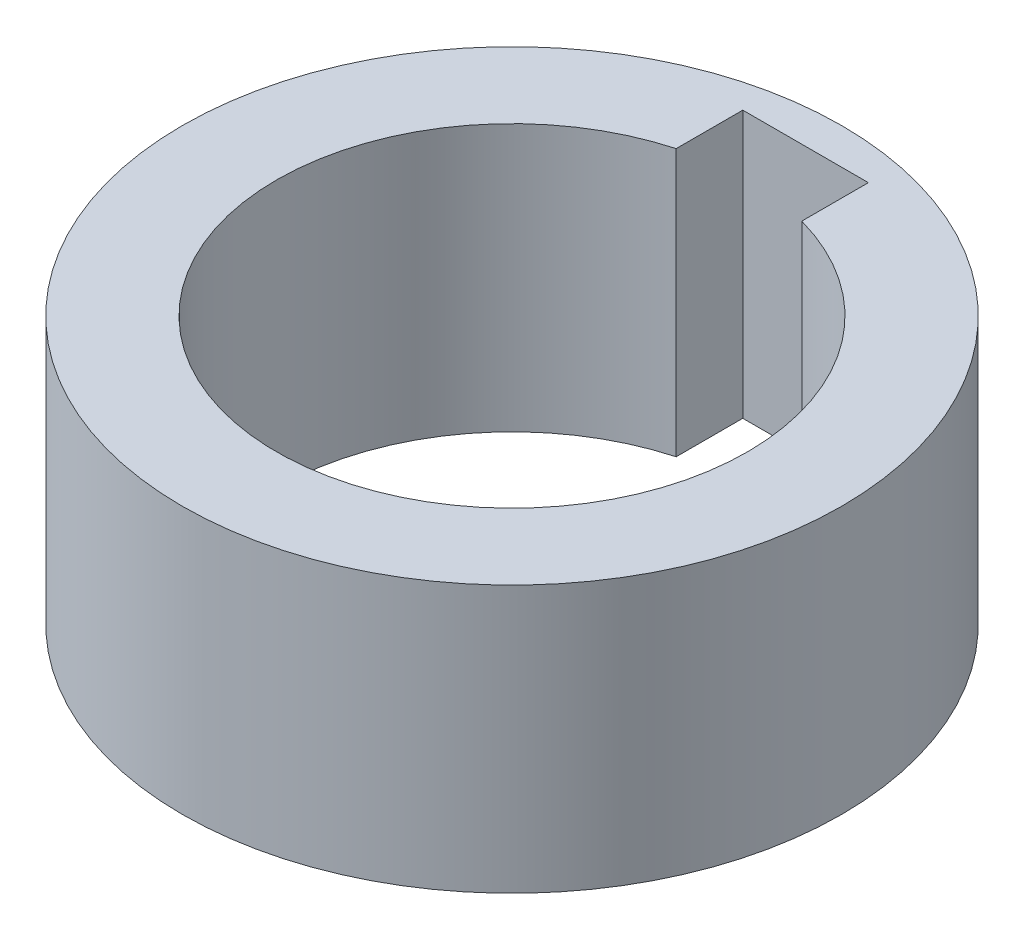
ISO-10303-21;
HEADER;
FILE_DESCRIPTION(('STEP AP214'),'2;1');
FILE_NAME('part.step','',(''),(''),'','','');
FILE_SCHEMA(('AUTOMOTIVE_DESIGN { 1 0 10303 214 1 1 1 1 }'));
ENDSEC;
DATA;
#1=APPLICATION_CONTEXT('core data for automotive mechanical design processes');
#2=APPLICATION_PROTOCOL_DEFINITION('international standard','automotive_design',2000,#1);
#3=PRODUCT_CONTEXT('',#1,'mechanical');
#4=PRODUCT('Part','Part','',(#3));
#5=PRODUCT_RELATED_PRODUCT_CATEGORY('part','',(#4));
#6=PRODUCT_DEFINITION_FORMATION('','',#4);
#7=PRODUCT_DEFINITION_CONTEXT('part definition',#1,'design');
#8=PRODUCT_DEFINITION('design','',#6,#7);
#9=PRODUCT_DEFINITION_SHAPE('','',#8);
#10=(LENGTH_UNIT() NAMED_UNIT(*) SI_UNIT(.MILLI.,.METRE.));
#11=(NAMED_UNIT(*) PLANE_ANGLE_UNIT() SI_UNIT($,.RADIAN.));
#12=(NAMED_UNIT(*) SI_UNIT($,.STERADIAN.) SOLID_ANGLE_UNIT());
#13=UNCERTAINTY_MEASURE_WITH_UNIT(LENGTH_MEASURE(1.E-05),#10,'distance_accuracy_value','');
#14=(GEOMETRIC_REPRESENTATION_CONTEXT(3) GLOBAL_UNCERTAINTY_ASSIGNED_CONTEXT((#13)) GLOBAL_UNIT_ASSIGNED_CONTEXT((#10,
#11,#12)) REPRESENTATION_CONTEXT('',''));
#15=CARTESIAN_POINT('',(0.,0.,0.));
#16=DIRECTION('',(0.,0.,1.));
#17=DIRECTION('',(1.,0.,0.));
#18=AXIS2_PLACEMENT_3D('',#15,#16,#17);
#19=CARTESIAN_POINT('',(0.,-17.,0.));
#20=DIRECTION('',(0.,1.,0.));
#21=DIRECTION('',(0.,0.,1.));
#22=AXIS2_PLACEMENT_3D('',#19,#20,#21);
#23=PLANE('',#22);
#24=CARTESIAN_POINT('',(0.,-17.,0.));
#25=DIRECTION('',(0.,1.,0.));
#26=DIRECTION('',(0.,0.,1.));
#27=AXIS2_PLACEMENT_3D('',#24,#25,#26);
#28=CIRCLE('',#27,21.);
#29=CARTESIAN_POINT('',(0.,-17.,21.));
#30=VERTEX_POINT('',#29);
#31=EDGE_CURVE('E11',#30,#30,#28,.T.);
#32=ORIENTED_EDGE('',*,*,#31,.F.);
#33=EDGE_LOOP('',(#32));
#34=FACE_BOUND('',#33,.T.);
#35=DIRECTION('',(0.,0.,1.));
#36=VECTOR('',#35,1.);
#37=CARTESIAN_POINT('',(4.,-17.,-18.7));
#38=LINE('',#37,#36);
#39=CARTESIAN_POINT('',(4.,-17.,-18.7));
#40=VERTEX_POINT('',#39);
#41=CARTESIAN_POINT('',(4.,-17.,-14.456832294801));
#42=VERTEX_POINT('',#41);
#43=EDGE_CURVE('E74',#40,#42,#38,.T.);
#44=ORIENTED_EDGE('',*,*,#43,.F.);
#45=DIRECTION('',(-1.,0.,0.));
#46=VECTOR('',#45,1.);
#47=CARTESIAN_POINT('',(4.,-17.,-18.7));
#48=LINE('',#47,#46);
#49=CARTESIAN_POINT('',(-4.,-17.,-18.7));
#50=VERTEX_POINT('',#49);
#51=EDGE_CURVE('E92',#40,#50,#48,.T.);
#52=ORIENTED_EDGE('',*,*,#51,.T.);
#53=DIRECTION('',(0.,0.,1.));
#54=VECTOR('',#53,1.);
#55=CARTESIAN_POINT('',(-4.,-17.,-18.7));
#56=LINE('',#55,#54);
#57=CARTESIAN_POINT('',(-4.,-17.,-14.456832294801));
#58=VERTEX_POINT('',#57);
#59=EDGE_CURVE('E80',#50,#58,#56,.T.);
#60=ORIENTED_EDGE('',*,*,#59,.T.);
#61=CARTESIAN_POINT('',(0.,-17.,0.));
#62=DIRECTION('',(0.,1.,0.));
#63=DIRECTION('',(0.,0.,1.));
#64=AXIS2_PLACEMENT_3D('',#61,#62,#63);
#65=CIRCLE('',#64,15.);
#66=EDGE_CURVE('E91',#58,#42,#65,.T.);
#67=ORIENTED_EDGE('',*,*,#66,.T.);
#68=EDGE_LOOP('',(#44,#52,#60,#67));
#69=FACE_BOUND('',#68,.T.);
#70=ADVANCED_FACE('F33',(#34,#69),#23,.F.);
#71=CARTESIAN_POINT('',(0.,0.,0.));
#72=DIRECTION('',(0.,1.,0.));
#73=DIRECTION('',(0.,0.,1.));
#74=AXIS2_PLACEMENT_3D('',#71,#72,#73);
#75=PLANE('',#74);
#76=CARTESIAN_POINT('',(0.,0.,0.));
#77=DIRECTION('',(0.,1.,0.));
#78=DIRECTION('',(0.,0.,1.));
#79=AXIS2_PLACEMENT_3D('',#76,#77,#78);
#80=CIRCLE('',#79,21.);
#81=CARTESIAN_POINT('',(0.,0.,21.));
#82=VERTEX_POINT('',#81);
#83=EDGE_CURVE('E37',#82,#82,#80,.T.);
#84=ORIENTED_EDGE('',*,*,#83,.T.);
#85=EDGE_LOOP('',(#84));
#86=FACE_BOUND('',#85,.T.);
#87=DIRECTION('',(-1.,0.,0.));
#88=VECTOR('',#87,1.);
#89=CARTESIAN_POINT('',(4.,0.,-18.7));
#90=LINE('',#89,#88);
#91=CARTESIAN_POINT('',(4.,0.,-18.7));
#92=VERTEX_POINT('',#91);
#93=CARTESIAN_POINT('',(-4.,0.,-18.7));
#94=VERTEX_POINT('',#93);
#95=EDGE_CURVE('E103',#92,#94,#90,.T.);
#96=ORIENTED_EDGE('',*,*,#95,.F.);
#97=DIRECTION('',(0.,0.,1.));
#98=VECTOR('',#97,1.);
#99=CARTESIAN_POINT('',(4.,0.,-18.7));
#100=LINE('',#99,#98);
#101=CARTESIAN_POINT('',(4.,0.,-14.456832294801));
#102=VERTEX_POINT('',#101);
#103=EDGE_CURVE('E106',#92,#102,#100,.T.);
#104=ORIENTED_EDGE('',*,*,#103,.T.);
#105=CARTESIAN_POINT('',(0.,0.,0.));
#106=DIRECTION('',(0.,1.,0.));
#107=DIRECTION('',(0.,0.,1.));
#108=AXIS2_PLACEMENT_3D('',#105,#106,#107);
#109=CIRCLE('',#108,15.);
#110=CARTESIAN_POINT('',(-4.,0.,-14.456832294801));
#111=VERTEX_POINT('',#110);
#112=EDGE_CURVE('E95',#111,#102,#109,.T.);
#113=ORIENTED_EDGE('',*,*,#112,.F.);
#114=DIRECTION('',(0.,0.,1.));
#115=VECTOR('',#114,1.);
#116=CARTESIAN_POINT('',(-4.,0.,-18.7));
#117=LINE('',#116,#115);
#118=EDGE_CURVE('E48',#94,#111,#117,.T.);
#119=ORIENTED_EDGE('',*,*,#118,.F.);
#120=EDGE_LOOP('',(#96,#104,#113,#119));
#121=FACE_BOUND('',#120,.T.);
#122=ADVANCED_FACE('F112',(#86,#121),#75,.T.);
#123=CARTESIAN_POINT('',(0.,-17.,0.));
#124=DIRECTION('',(0.,1.,0.));
#125=DIRECTION('',(0.,0.,1.));
#126=AXIS2_PLACEMENT_3D('',#123,#124,#125);
#127=CYLINDRICAL_SURFACE('',#126,15.);
#128=DIRECTION('',(0.,1.,0.));
#129=VECTOR('',#128,1.);
#130=CARTESIAN_POINT('',(4.,-17.,-14.456832294801));
#131=LINE('',#130,#129);
#132=EDGE_CURVE('E86',#42,#102,#131,.T.);
#133=ORIENTED_EDGE('',*,*,#132,.F.);
#134=ORIENTED_EDGE('',*,*,#66,.F.);
#135=DIRECTION('',(0.,1.,0.));
#136=VECTOR('',#135,1.);
#137=CARTESIAN_POINT('',(-4.,-17.,-14.456832294801));
#138=LINE('',#137,#136);
#139=EDGE_CURVE('E77',#58,#111,#138,.T.);
#140=ORIENTED_EDGE('',*,*,#139,.T.);
#141=ORIENTED_EDGE('',*,*,#112,.T.);
#142=EDGE_LOOP('',(#133,#134,#140,#141));
#143=FACE_BOUND('',#142,.T.);
#144=ADVANCED_FACE('F94',(#143),#127,.F.);
#145=CARTESIAN_POINT('',(0.,-17.,0.));
#146=DIRECTION('',(0.,1.,0.));
#147=DIRECTION('',(0.,0.,1.));
#148=AXIS2_PLACEMENT_3D('',#145,#146,#147);
#149=CYLINDRICAL_SURFACE('',#148,21.);
#150=ORIENTED_EDGE('',*,*,#31,.T.);
#151=EDGE_LOOP('',(#150));
#152=FACE_BOUND('',#151,.T.);
#153=ORIENTED_EDGE('',*,*,#83,.F.);
#154=EDGE_LOOP('',(#153));
#155=FACE_BOUND('',#154,.T.);
#156=ADVANCED_FACE('F35',(#152,#155),#149,.T.);
#157=CARTESIAN_POINT('',(4.,-17.,-18.7));
#158=DIRECTION('',(-1.,0.,0.));
#159=DIRECTION('',(0.,0.,1.));
#160=AXIS2_PLACEMENT_3D('',#157,#158,#159);
#161=PLANE('',#160);
#162=ORIENTED_EDGE('',*,*,#103,.F.);
#163=DIRECTION('',(0.,1.,0.));
#164=VECTOR('',#163,1.);
#165=CARTESIAN_POINT('',(4.,-17.,-18.7));
#166=LINE('',#165,#164);
#167=EDGE_CURVE('E57',#40,#92,#166,.T.);
#168=ORIENTED_EDGE('',*,*,#167,.F.);
#169=ORIENTED_EDGE('',*,*,#43,.T.);
#170=ORIENTED_EDGE('',*,*,#132,.T.);
#171=EDGE_LOOP('',(#162,#168,#169,#170));
#172=FACE_BOUND('',#171,.T.);
#173=ADVANCED_FACE('F113',(#172),#161,.T.);
#174=CARTESIAN_POINT('',(-4.,-17.,-18.7));
#175=DIRECTION('',(-1.,0.,0.));
#176=DIRECTION('',(0.,0.,1.));
#177=AXIS2_PLACEMENT_3D('',#174,#175,#176);
#178=PLANE('',#177);
#179=ORIENTED_EDGE('',*,*,#118,.T.);
#180=ORIENTED_EDGE('',*,*,#139,.F.);
#181=ORIENTED_EDGE('',*,*,#59,.F.);
#182=DIRECTION('',(0.,1.,0.));
#183=VECTOR('',#182,1.);
#184=CARTESIAN_POINT('',(-4.,-17.,-18.7));
#185=LINE('',#184,#183);
#186=EDGE_CURVE('E87',#50,#94,#185,.T.);
#187=ORIENTED_EDGE('',*,*,#186,.T.);
#188=EDGE_LOOP('',(#179,#180,#181,#187));
#189=FACE_BOUND('',#188,.T.);
#190=ADVANCED_FACE('F79',(#189),#178,.F.);
#191=CARTESIAN_POINT('',(4.,-17.,-18.7));
#192=DIRECTION('',(0.,0.,-1.));
#193=DIRECTION('',(-1.,0.,0.));
#194=AXIS2_PLACEMENT_3D('',#191,#192,#193);
#195=PLANE('',#194);
#196=ORIENTED_EDGE('',*,*,#95,.T.);
#197=ORIENTED_EDGE('',*,*,#186,.F.);
#198=ORIENTED_EDGE('',*,*,#51,.F.);
#199=ORIENTED_EDGE('',*,*,#167,.T.);
#200=EDGE_LOOP('',(#196,#197,#198,#199));
#201=FACE_BOUND('',#200,.T.);
#202=ADVANCED_FACE('F120',(#201),#195,.F.);
#203=CLOSED_SHELL('',(#70,#122,#144,#156,#173,#190,#202));
#204=MANIFOLD_SOLID_BREP('B2',#203);
#205=ADVANCED_BREP_SHAPE_REPRESENTATION('',(#18,#204),#14);
#206=SHAPE_DEFINITION_REPRESENTATION(#9,#205);
ENDSEC;
END-ISO-10303-21;
